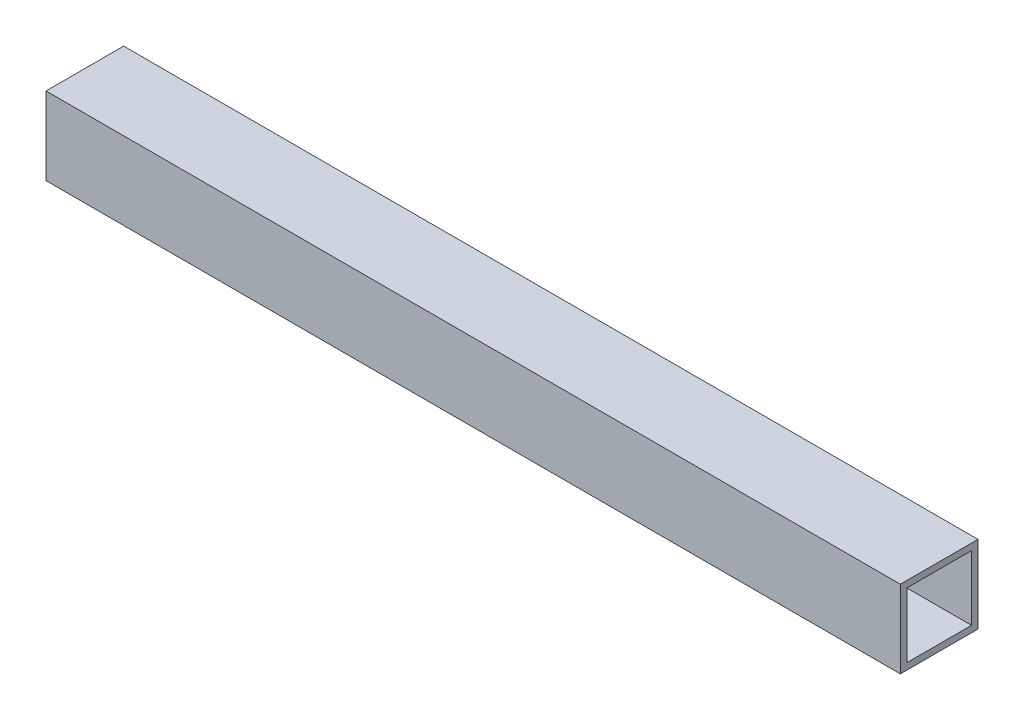
ISO-10303-21;
HEADER;
FILE_DESCRIPTION(('STEP AP214'),'2;1');
FILE_NAME('part.step','',(''),(''),'','','');
FILE_SCHEMA(('AUTOMOTIVE_DESIGN { 1 0 10303 214 1 1 1 1 }'));
ENDSEC;
DATA;
#1=APPLICATION_CONTEXT('core data for automotive mechanical design processes');
#2=APPLICATION_PROTOCOL_DEFINITION('international standard','automotive_design',2000,#1);
#3=PRODUCT_CONTEXT('',#1,'mechanical');
#4=PRODUCT('Part','Part','',(#3));
#5=PRODUCT_RELATED_PRODUCT_CATEGORY('part','',(#4));
#6=PRODUCT_DEFINITION_FORMATION('','',#4);
#7=PRODUCT_DEFINITION_CONTEXT('part definition',#1,'design');
#8=PRODUCT_DEFINITION('design','',#6,#7);
#9=PRODUCT_DEFINITION_SHAPE('','',#8);
#10=(LENGTH_UNIT() NAMED_UNIT(*) SI_UNIT(.MILLI.,.METRE.));
#11=(NAMED_UNIT(*) PLANE_ANGLE_UNIT() SI_UNIT($,.RADIAN.));
#12=(NAMED_UNIT(*) SI_UNIT($,.STERADIAN.) SOLID_ANGLE_UNIT());
#13=UNCERTAINTY_MEASURE_WITH_UNIT(LENGTH_MEASURE(1.E-05),#10,'distance_accuracy_value','');
#14=(GEOMETRIC_REPRESENTATION_CONTEXT(3) GLOBAL_UNCERTAINTY_ASSIGNED_CONTEXT((#13)) GLOBAL_UNIT_ASSIGNED_CONTEXT((#10,
#11,#12)) REPRESENTATION_CONTEXT('',''));
#15=CARTESIAN_POINT('',(0.,0.,0.));
#16=DIRECTION('',(0.,0.,1.));
#17=DIRECTION('',(1.,0.,0.));
#18=AXIS2_PLACEMENT_3D('',#15,#16,#17);
#19=CARTESIAN_POINT('',(104.775,0.,0.));
#20=DIRECTION('',(1.,0.,0.));
#21=DIRECTION('',(0.,0.,-1.));
#22=AXIS2_PLACEMENT_3D('',#19,#20,#21);
#23=PLANE('',#22);
#24=DIRECTION('',(0.,0.,-1.));
#25=VECTOR('',#24,1.);
#26=CARTESIAN_POINT('',(104.775,-9.525,-9.525));
#27=LINE('',#26,#25);
#28=CARTESIAN_POINT('',(104.775,-9.525,9.525));
#29=VERTEX_POINT('',#28);
#30=CARTESIAN_POINT('',(104.775,-9.525,-9.525));
#31=VERTEX_POINT('',#30);
#32=EDGE_CURVE('E138',#29,#31,#27,.T.);
#33=ORIENTED_EDGE('',*,*,#32,.T.);
#34=DIRECTION('',(0.,1.,0.));
#35=VECTOR('',#34,1.);
#36=CARTESIAN_POINT('',(104.775,9.525,-9.525));
#37=LINE('',#36,#35);
#38=CARTESIAN_POINT('',(104.775,9.525,-9.525));
#39=VERTEX_POINT('',#38);
#40=EDGE_CURVE('E141',#31,#39,#37,.T.);
#41=ORIENTED_EDGE('',*,*,#40,.T.);
#42=DIRECTION('',(0.,0.,1.));
#43=VECTOR('',#42,1.);
#44=CARTESIAN_POINT('',(104.775,9.525,-9.525));
#45=LINE('',#44,#43);
#46=CARTESIAN_POINT('',(104.775,9.525,9.525));
#47=VERTEX_POINT('',#46);
#48=EDGE_CURVE('E144',#39,#47,#45,.T.);
#49=ORIENTED_EDGE('',*,*,#48,.T.);
#50=DIRECTION('',(0.,-1.,0.));
#51=VECTOR('',#50,1.);
#52=CARTESIAN_POINT('',(104.775,9.525,9.525));
#53=LINE('',#52,#51);
#54=EDGE_CURVE('E146',#47,#29,#53,.T.);
#55=ORIENTED_EDGE('',*,*,#54,.T.);
#56=EDGE_LOOP('',(#33,#41,#49,#55));
#57=FACE_BOUND('',#56,.T.);
#58=DIRECTION('',(0.,1.,0.));
#59=VECTOR('',#58,1.);
#60=CARTESIAN_POINT('',(104.775,7.9375,-7.9375));
#61=LINE('',#60,#59);
#62=CARTESIAN_POINT('',(104.775,-7.9375,-7.9375));
#63=VERTEX_POINT('',#62);
#64=CARTESIAN_POINT('',(104.775,7.9375,-7.9375));
#65=VERTEX_POINT('',#64);
#66=EDGE_CURVE('E108',#63,#65,#61,.T.);
#67=ORIENTED_EDGE('',*,*,#66,.F.);
#68=DIRECTION('',(0.,0.,-1.));
#69=VECTOR('',#68,1.);
#70=CARTESIAN_POINT('',(104.775,-7.9375,-7.9375));
#71=LINE('',#70,#69);
#72=CARTESIAN_POINT('',(104.775,-7.9375,7.9375));
#73=VERTEX_POINT('',#72);
#74=EDGE_CURVE('E100',#73,#63,#71,.T.);
#75=ORIENTED_EDGE('',*,*,#74,.F.);
#76=DIRECTION('',(0.,-1.,0.));
#77=VECTOR('',#76,1.);
#78=CARTESIAN_POINT('',(104.775,7.9375,7.9375));
#79=LINE('',#78,#77);
#80=CARTESIAN_POINT('',(104.775,7.9375,7.9375));
#81=VERTEX_POINT('',#80);
#82=EDGE_CURVE('E122',#81,#73,#79,.T.);
#83=ORIENTED_EDGE('',*,*,#82,.F.);
#84=DIRECTION('',(0.,0.,1.));
#85=VECTOR('',#84,1.);
#86=CARTESIAN_POINT('',(104.775,7.9375,-7.9375));
#87=LINE('',#86,#85);
#88=EDGE_CURVE('E120',#65,#81,#87,.T.);
#89=ORIENTED_EDGE('',*,*,#88,.F.);
#90=EDGE_LOOP('',(#67,#75,#83,#89));
#91=FACE_BOUND('',#90,.T.);
#92=ADVANCED_FACE('F35',(#57,#91),#23,.T.);
#93=CARTESIAN_POINT('',(-104.775,0.,0.));
#94=DIRECTION('',(1.,0.,0.));
#95=DIRECTION('',(0.,0.,-1.));
#96=AXIS2_PLACEMENT_3D('',#93,#94,#95);
#97=PLANE('',#96);
#98=DIRECTION('',(0.,0.,-1.));
#99=VECTOR('',#98,1.);
#100=CARTESIAN_POINT('',(-104.775,-9.525,-9.525));
#101=LINE('',#100,#99);
#102=CARTESIAN_POINT('',(-104.775,-9.525,9.525));
#103=VERTEX_POINT('',#102);
#104=CARTESIAN_POINT('',(-104.775,-9.525,-9.525));
#105=VERTEX_POINT('',#104);
#106=EDGE_CURVE('E116',#103,#105,#101,.T.);
#107=ORIENTED_EDGE('',*,*,#106,.F.);
#108=DIRECTION('',(0.,-1.,0.));
#109=VECTOR('',#108,1.);
#110=CARTESIAN_POINT('',(-104.775,9.525,9.525));
#111=LINE('',#110,#109);
#112=CARTESIAN_POINT('',(-104.775,9.525,9.525));
#113=VERTEX_POINT('',#112);
#114=EDGE_CURVE('E142',#113,#103,#111,.T.);
#115=ORIENTED_EDGE('',*,*,#114,.F.);
#116=DIRECTION('',(0.,0.,1.));
#117=VECTOR('',#116,1.);
#118=CARTESIAN_POINT('',(-104.775,9.525,-9.525));
#119=LINE('',#118,#117);
#120=CARTESIAN_POINT('',(-104.775,9.525,-9.525));
#121=VERTEX_POINT('',#120);
#122=EDGE_CURVE('E153',#121,#113,#119,.T.);
#123=ORIENTED_EDGE('',*,*,#122,.F.);
#124=DIRECTION('',(0.,1.,0.));
#125=VECTOR('',#124,1.);
#126=CARTESIAN_POINT('',(-104.775,9.525,-9.525));
#127=LINE('',#126,#125);
#128=EDGE_CURVE('E151',#105,#121,#127,.T.);
#129=ORIENTED_EDGE('',*,*,#128,.F.);
#130=EDGE_LOOP('',(#107,#115,#123,#129));
#131=FACE_BOUND('',#130,.T.);
#132=DIRECTION('',(0.,0.,-1.));
#133=VECTOR('',#132,1.);
#134=CARTESIAN_POINT('',(-104.775,-7.9375,-7.9375));
#135=LINE('',#134,#133);
#136=CARTESIAN_POINT('',(-104.775,-7.9375,7.9375));
#137=VERTEX_POINT('',#136);
#138=CARTESIAN_POINT('',(-104.775,-7.9375,-7.9375));
#139=VERTEX_POINT('',#138);
#140=EDGE_CURVE('E58',#137,#139,#135,.T.);
#141=ORIENTED_EDGE('',*,*,#140,.T.);
#142=DIRECTION('',(0.,1.,0.));
#143=VECTOR('',#142,1.);
#144=CARTESIAN_POINT('',(-104.775,7.9375,-7.9375));
#145=LINE('',#144,#143);
#146=CARTESIAN_POINT('',(-104.775,7.9375,-7.9375));
#147=VERTEX_POINT('',#146);
#148=EDGE_CURVE('E115',#139,#147,#145,.T.);
#149=ORIENTED_EDGE('',*,*,#148,.T.);
#150=DIRECTION('',(0.,0.,1.));
#151=VECTOR('',#150,1.);
#152=CARTESIAN_POINT('',(-104.775,7.9375,-7.9375));
#153=LINE('',#152,#151);
#154=CARTESIAN_POINT('',(-104.775,7.9375,7.9375));
#155=VERTEX_POINT('',#154);
#156=EDGE_CURVE('E130',#147,#155,#153,.T.);
#157=ORIENTED_EDGE('',*,*,#156,.T.);
#158=DIRECTION('',(0.,-1.,0.));
#159=VECTOR('',#158,1.);
#160=CARTESIAN_POINT('',(-104.775,7.9375,7.9375));
#161=LINE('',#160,#159);
#162=EDGE_CURVE('E109',#155,#137,#161,.T.);
#163=ORIENTED_EDGE('',*,*,#162,.T.);
#164=EDGE_LOOP('',(#141,#149,#157,#163));
#165=FACE_BOUND('',#164,.T.);
#166=ADVANCED_FACE('F171',(#131,#165),#97,.F.);
#167=CARTESIAN_POINT('',(104.775,-9.525,-9.525));
#168=DIRECTION('',(0.,1.,0.));
#169=DIRECTION('',(0.,0.,1.));
#170=AXIS2_PLACEMENT_3D('',#167,#168,#169);
#171=PLANE('',#170);
#172=CARTESIAN_POINT('',(58.025000028,-9.525,0.));
#173=DIRECTION('',(0.,-1.,0.));
#174=DIRECTION('',(0.,0.,-1.));
#175=AXIS2_PLACEMENT_3D('',#172,#173,#174);
#176=CIRCLE('',#175,2.4257);
#177=CARTESIAN_POINT('',(58.025000028,-9.525,-2.42570000000001));
#178=VERTEX_POINT('',#177);
#179=EDGE_CURVE('E128',#178,#178,#176,.T.);
#180=ORIENTED_EDGE('',*,*,#179,.F.);
#181=EDGE_LOOP('',(#180));
#182=FACE_BOUND('',#181,.T.);
#183=ORIENTED_EDGE('',*,*,#106,.T.);
#184=DIRECTION('',(-1.,0.,0.));
#185=VECTOR('',#184,1.);
#186=CARTESIAN_POINT('',(104.775,-9.525,-9.525));
#187=LINE('',#186,#185);
#188=EDGE_CURVE('E11',#31,#105,#187,.T.);
#189=ORIENTED_EDGE('',*,*,#188,.F.);
#190=ORIENTED_EDGE('',*,*,#32,.F.);
#191=DIRECTION('',(-1.,0.,0.));
#192=VECTOR('',#191,1.);
#193=CARTESIAN_POINT('',(104.775,-9.525,9.525));
#194=LINE('',#193,#192);
#195=EDGE_CURVE('E148',#29,#103,#194,.T.);
#196=ORIENTED_EDGE('',*,*,#195,.T.);
#197=EDGE_LOOP('',(#183,#189,#190,#196));
#198=FACE_BOUND('',#197,.T.);
#199=ADVANCED_FACE('F37',(#182,#198),#171,.F.);
#200=CARTESIAN_POINT('',(104.775,9.525,-9.525));
#201=DIRECTION('',(0.,0.,1.));
#202=DIRECTION('',(1.,0.,0.));
#203=AXIS2_PLACEMENT_3D('',#200,#201,#202);
#204=PLANE('',#203);
#205=CARTESIAN_POINT('',(73.025,0.,-9.525));
#206=DIRECTION('',(0.,0.,1.));
#207=DIRECTION('',(1.,0.,0.));
#208=AXIS2_PLACEMENT_3D('',#205,#206,#207);
#209=CIRCLE('',#208,2.4257);
#210=CARTESIAN_POINT('',(75.4507,0.,-9.525));
#211=VERTEX_POINT('',#210);
#212=EDGE_CURVE('E227',#211,#211,#209,.T.);
#213=ORIENTED_EDGE('',*,*,#212,.T.);
#214=EDGE_LOOP('',(#213));
#215=FACE_BOUND('',#214,.T.);
#216=CARTESIAN_POINT('',(-66.675,0.,-9.525));
#217=DIRECTION('',(0.,0.,1.));
#218=DIRECTION('',(1.,0.,0.));
#219=AXIS2_PLACEMENT_3D('',#216,#217,#218);
#220=CIRCLE('',#219,2.4257);
#221=CARTESIAN_POINT('',(-64.2493,0.,-9.525));
#222=VERTEX_POINT('',#221);
#223=EDGE_CURVE('E219',#222,#222,#220,.T.);
#224=ORIENTED_EDGE('',*,*,#223,.T.);
#225=EDGE_LOOP('',(#224));
#226=FACE_BOUND('',#225,.T.);
#227=ORIENTED_EDGE('',*,*,#128,.T.);
#228=DIRECTION('',(-1.,0.,0.));
#229=VECTOR('',#228,1.);
#230=CARTESIAN_POINT('',(104.775,9.525,-9.525));
#231=LINE('',#230,#229);
#232=EDGE_CURVE('E43',#39,#121,#231,.T.);
#233=ORIENTED_EDGE('',*,*,#232,.F.);
#234=ORIENTED_EDGE('',*,*,#40,.F.);
#235=ORIENTED_EDGE('',*,*,#188,.T.);
#236=EDGE_LOOP('',(#227,#233,#234,#235));
#237=FACE_BOUND('',#236,.T.);
#238=ADVANCED_FACE('F181',(#215,#226,#237),#204,.F.);
#239=CARTESIAN_POINT('',(104.775,9.525,-9.525));
#240=DIRECTION('',(0.,-1.,0.));
#241=DIRECTION('',(0.,0.,-1.));
#242=AXIS2_PLACEMENT_3D('',#239,#240,#241);
#243=PLANE('',#242);
#244=ORIENTED_EDGE('',*,*,#122,.T.);
#245=DIRECTION('',(-1.,0.,0.));
#246=VECTOR('',#245,1.);
#247=CARTESIAN_POINT('',(104.775,9.525,9.525));
#248=LINE('',#247,#246);
#249=EDGE_CURVE('E158',#47,#113,#248,.T.);
#250=ORIENTED_EDGE('',*,*,#249,.F.);
#251=ORIENTED_EDGE('',*,*,#48,.F.);
#252=ORIENTED_EDGE('',*,*,#232,.T.);
#253=EDGE_LOOP('',(#244,#250,#251,#252));
#254=FACE_BOUND('',#253,.T.);
#255=ADVANCED_FACE('F165',(#254),#243,.F.);
#256=CARTESIAN_POINT('',(104.775,9.525,9.525));
#257=DIRECTION('',(0.,0.,-1.));
#258=DIRECTION('',(-1.,0.,0.));
#259=AXIS2_PLACEMENT_3D('',#256,#257,#258);
#260=PLANE('',#259);
#261=ORIENTED_EDGE('',*,*,#114,.T.);
#262=ORIENTED_EDGE('',*,*,#195,.F.);
#263=ORIENTED_EDGE('',*,*,#54,.F.);
#264=ORIENTED_EDGE('',*,*,#249,.T.);
#265=EDGE_LOOP('',(#261,#262,#263,#264));
#266=FACE_BOUND('',#265,.T.);
#267=ADVANCED_FACE('F175',(#266),#260,.F.);
#268=CARTESIAN_POINT('',(104.775,-7.9375,-7.9375));
#269=DIRECTION('',(0.,1.,0.));
#270=DIRECTION('',(0.,0.,1.));
#271=AXIS2_PLACEMENT_3D('',#268,#269,#270);
#272=PLANE('',#271);
#273=CARTESIAN_POINT('',(58.025000028,-7.9375,0.));
#274=DIRECTION('',(0.,1.,0.));
#275=DIRECTION('',(0.,0.,1.));
#276=AXIS2_PLACEMENT_3D('',#273,#274,#275);
#277=CIRCLE('',#276,2.4257);
#278=CARTESIAN_POINT('',(58.025000028,-7.9375,2.4257));
#279=VERTEX_POINT('',#278);
#280=EDGE_CURVE('E213',#279,#279,#277,.F.);
#281=ORIENTED_EDGE('',*,*,#280,.T.);
#282=EDGE_LOOP('',(#281));
#283=FACE_BOUND('',#282,.T.);
#284=ORIENTED_EDGE('',*,*,#140,.F.);
#285=DIRECTION('',(-1.,0.,0.));
#286=VECTOR('',#285,1.);
#287=CARTESIAN_POINT('',(104.775,-7.9375,7.9375));
#288=LINE('',#287,#286);
#289=EDGE_CURVE('E104',#73,#137,#288,.T.);
#290=ORIENTED_EDGE('',*,*,#289,.F.);
#291=ORIENTED_EDGE('',*,*,#74,.T.);
#292=DIRECTION('',(-1.,0.,0.));
#293=VECTOR('',#292,1.);
#294=CARTESIAN_POINT('',(104.775,-7.9375,-7.9375));
#295=LINE('',#294,#293);
#296=EDGE_CURVE('E103',#63,#139,#295,.T.);
#297=ORIENTED_EDGE('',*,*,#296,.T.);
#298=EDGE_LOOP('',(#284,#290,#291,#297));
#299=FACE_BOUND('',#298,.T.);
#300=ADVANCED_FACE('F102',(#283,#299),#272,.T.);
#301=CARTESIAN_POINT('',(104.775,7.9375,-7.9375));
#302=DIRECTION('',(0.,0.,1.));
#303=DIRECTION('',(1.,0.,0.));
#304=AXIS2_PLACEMENT_3D('',#301,#302,#303);
#305=PLANE('',#304);
#306=CARTESIAN_POINT('',(73.025,0.,-7.9375));
#307=DIRECTION('',(0.,0.,1.));
#308=DIRECTION('',(1.,0.,0.));
#309=AXIS2_PLACEMENT_3D('',#306,#307,#308);
#310=CIRCLE('',#309,2.4257);
#311=CARTESIAN_POINT('',(75.4507,0.,-7.9375));
#312=VERTEX_POINT('',#311);
#313=EDGE_CURVE('E224',#312,#312,#310,.T.);
#314=ORIENTED_EDGE('',*,*,#313,.F.);
#315=EDGE_LOOP('',(#314));
#316=FACE_BOUND('',#315,.T.);
#317=CARTESIAN_POINT('',(-66.675,0.,-7.9375));
#318=DIRECTION('',(0.,0.,1.));
#319=DIRECTION('',(1.,0.,0.));
#320=AXIS2_PLACEMENT_3D('',#317,#318,#319);
#321=CIRCLE('',#320,2.4257);
#322=CARTESIAN_POINT('',(-64.2493,0.,-7.9375));
#323=VERTEX_POINT('',#322);
#324=EDGE_CURVE('E215',#323,#323,#321,.T.);
#325=ORIENTED_EDGE('',*,*,#324,.F.);
#326=EDGE_LOOP('',(#325));
#327=FACE_BOUND('',#326,.T.);
#328=ORIENTED_EDGE('',*,*,#148,.F.);
#329=ORIENTED_EDGE('',*,*,#296,.F.);
#330=ORIENTED_EDGE('',*,*,#66,.T.);
#331=DIRECTION('',(-1.,0.,0.));
#332=VECTOR('',#331,1.);
#333=CARTESIAN_POINT('',(104.775,7.9375,-7.9375));
#334=LINE('',#333,#332);
#335=EDGE_CURVE('E117',#65,#147,#334,.T.);
#336=ORIENTED_EDGE('',*,*,#335,.T.);
#337=EDGE_LOOP('',(#328,#329,#330,#336));
#338=FACE_BOUND('',#337,.T.);
#339=ADVANCED_FACE('F112',(#316,#327,#338),#305,.T.);
#340=CARTESIAN_POINT('',(104.775,7.9375,-7.9375));
#341=DIRECTION('',(0.,-1.,0.));
#342=DIRECTION('',(0.,0.,-1.));
#343=AXIS2_PLACEMENT_3D('',#340,#341,#342);
#344=PLANE('',#343);
#345=ORIENTED_EDGE('',*,*,#156,.F.);
#346=ORIENTED_EDGE('',*,*,#335,.F.);
#347=ORIENTED_EDGE('',*,*,#88,.T.);
#348=DIRECTION('',(-1.,0.,0.));
#349=VECTOR('',#348,1.);
#350=CARTESIAN_POINT('',(104.775,7.9375,7.9375));
#351=LINE('',#350,#349);
#352=EDGE_CURVE('E50',#81,#155,#351,.T.);
#353=ORIENTED_EDGE('',*,*,#352,.T.);
#354=EDGE_LOOP('',(#345,#346,#347,#353));
#355=FACE_BOUND('',#354,.T.);
#356=ADVANCED_FACE('F209',(#355),#344,.T.);
#357=CARTESIAN_POINT('',(104.775,7.9375,7.9375));
#358=DIRECTION('',(0.,0.,-1.));
#359=DIRECTION('',(-1.,0.,0.));
#360=AXIS2_PLACEMENT_3D('',#357,#358,#359);
#361=PLANE('',#360);
#362=ORIENTED_EDGE('',*,*,#162,.F.);
#363=ORIENTED_EDGE('',*,*,#352,.F.);
#364=ORIENTED_EDGE('',*,*,#82,.T.);
#365=ORIENTED_EDGE('',*,*,#289,.T.);
#366=EDGE_LOOP('',(#362,#363,#364,#365));
#367=FACE_BOUND('',#366,.T.);
#368=ADVANCED_FACE('F244',(#367),#361,.T.);
#369=CARTESIAN_POINT('',(58.025000028,9.52600000000001,0.));
#370=DIRECTION('',(0.,-1.,0.));
#371=DIRECTION('',(0.,0.,-1.));
#372=AXIS2_PLACEMENT_3D('',#369,#370,#371);
#373=CYLINDRICAL_SURFACE('',#372,2.4257);
#374=ORIENTED_EDGE('',*,*,#280,.F.);
#375=EDGE_LOOP('',(#374));
#376=FACE_BOUND('',#375,.T.);
#377=ORIENTED_EDGE('',*,*,#179,.T.);
#378=EDGE_LOOP('',(#377));
#379=FACE_BOUND('',#378,.T.);
#380=ADVANCED_FACE('F238',(#376,#379),#373,.F.);
#381=CARTESIAN_POINT('',(-66.675,0.,9.526));
#382=DIRECTION('',(0.,0.,-1.));
#383=DIRECTION('',(-1.,0.,0.));
#384=AXIS2_PLACEMENT_3D('',#381,#382,#383);
#385=CYLINDRICAL_SURFACE('',#384,2.4257);
#386=ORIENTED_EDGE('',*,*,#324,.T.);
#387=EDGE_LOOP('',(#386));
#388=FACE_BOUND('',#387,.T.);
#389=ORIENTED_EDGE('',*,*,#223,.F.);
#390=EDGE_LOOP('',(#389));
#391=FACE_BOUND('',#390,.T.);
#392=ADVANCED_FACE('F232',(#388,#391),#385,.F.);
#393=CARTESIAN_POINT('',(73.025,0.,9.526));
#394=DIRECTION('',(0.,0.,-1.));
#395=DIRECTION('',(-1.,0.,0.));
#396=AXIS2_PLACEMENT_3D('',#393,#394,#395);
#397=CYLINDRICAL_SURFACE('',#396,2.4257);
#398=ORIENTED_EDGE('',*,*,#313,.T.);
#399=EDGE_LOOP('',(#398));
#400=FACE_BOUND('',#399,.T.);
#401=ORIENTED_EDGE('',*,*,#212,.F.);
#402=EDGE_LOOP('',(#401));
#403=FACE_BOUND('',#402,.T.);
#404=ADVANCED_FACE('F230',(#400,#403),#397,.F.);
#405=CLOSED_SHELL('',(#92,#166,#199,#238,#255,#267,#300,#339,#356,#368,#380,#392,#404));
#406=MANIFOLD_SOLID_BREP('B2',#405);
#407=ADVANCED_BREP_SHAPE_REPRESENTATION('',(#18,#406),#14);
#408=SHAPE_DEFINITION_REPRESENTATION(#9,#407);
ENDSEC;
END-ISO-10303-21;
